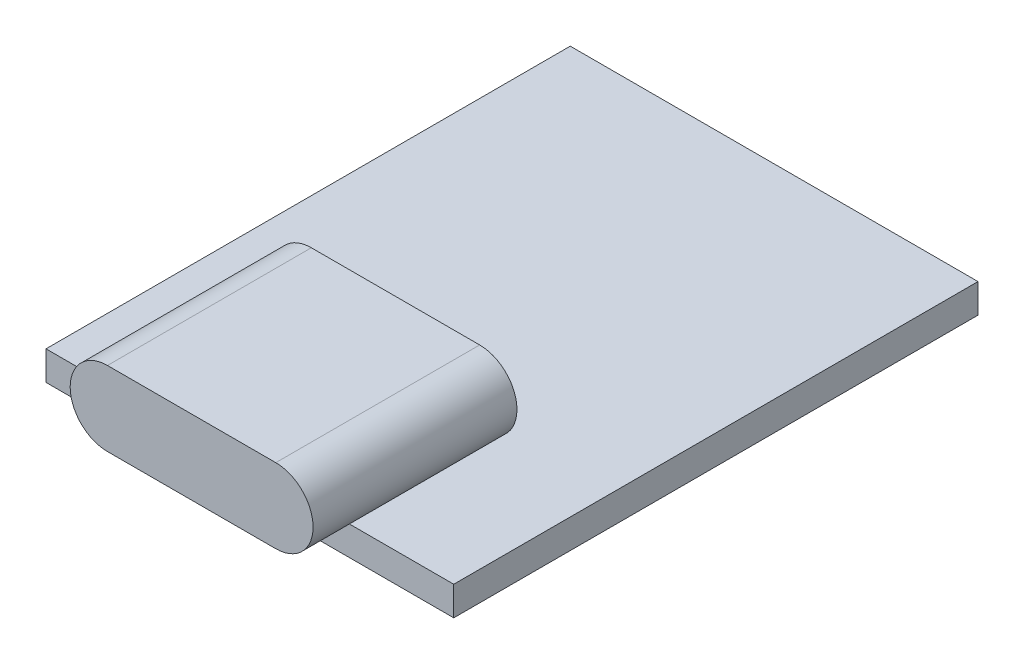
ISO-10303-21;
HEADER;
FILE_DESCRIPTION(('STEP AP214'),'2;1');
FILE_NAME('part.step','',(''),(''),'','','');
FILE_SCHEMA(('AUTOMOTIVE_DESIGN { 1 0 10303 214 1 1 1 1 }'));
ENDSEC;
DATA;
#1=APPLICATION_CONTEXT('core data for automotive mechanical design processes');
#2=APPLICATION_PROTOCOL_DEFINITION('international standard','automotive_design',2000,#1);
#3=PRODUCT_CONTEXT('',#1,'mechanical');
#4=PRODUCT('Part','Part','',(#3));
#5=PRODUCT_RELATED_PRODUCT_CATEGORY('part','',(#4));
#6=PRODUCT_DEFINITION_FORMATION('','',#4);
#7=PRODUCT_DEFINITION_CONTEXT('part definition',#1,'design');
#8=PRODUCT_DEFINITION('design','',#6,#7);
#9=PRODUCT_DEFINITION_SHAPE('','',#8);
#10=(LENGTH_UNIT() NAMED_UNIT(*) SI_UNIT(.MILLI.,.METRE.));
#11=(NAMED_UNIT(*) PLANE_ANGLE_UNIT() SI_UNIT($,.RADIAN.));
#12=(NAMED_UNIT(*) SI_UNIT($,.STERADIAN.) SOLID_ANGLE_UNIT());
#13=UNCERTAINTY_MEASURE_WITH_UNIT(LENGTH_MEASURE(1.E-05),#10,'distance_accuracy_value','');
#14=(GEOMETRIC_REPRESENTATION_CONTEXT(3) GLOBAL_UNCERTAINTY_ASSIGNED_CONTEXT((#13)) GLOBAL_UNIT_ASSIGNED_CONTEXT((#10,
#11,#12)) REPRESENTATION_CONTEXT('',''));
#15=CARTESIAN_POINT('',(0.,0.,0.));
#16=DIRECTION('',(0.,0.,1.));
#17=DIRECTION('',(1.,0.,0.));
#18=AXIS2_PLACEMENT_3D('',#15,#16,#17);
#19=CARTESIAN_POINT('',(0.,1.,0.));
#20=DIRECTION('',(1.,0.,0.));
#21=DIRECTION('',(0.,0.,-1.));
#22=AXIS2_PLACEMENT_3D('',#19,#20,#21);
#23=PLANE('',#22);
#24=DIRECTION('',(0.,0.,1.));
#25=VECTOR('',#24,1.);
#26=CARTESIAN_POINT('',(0.,0.,0.));
#27=LINE('',#26,#25);
#28=CARTESIAN_POINT('',(0.,0.,0.));
#29=VERTEX_POINT('',#28);
#30=CARTESIAN_POINT('',(0.,0.,18.));
#31=VERTEX_POINT('',#30);
#32=EDGE_CURVE('E153',#29,#31,#27,.T.);
#33=ORIENTED_EDGE('',*,*,#32,.T.);
#34=DIRECTION('',(0.,-1.,0.));
#35=VECTOR('',#34,1.);
#36=CARTESIAN_POINT('',(0.,1.,18.));
#37=LINE('',#36,#35);
#38=CARTESIAN_POINT('',(0.,1.,18.));
#39=VERTEX_POINT('',#38);
#40=EDGE_CURVE('E11',#39,#31,#37,.T.);
#41=ORIENTED_EDGE('',*,*,#40,.F.);
#42=DIRECTION('',(0.,0.,1.));
#43=VECTOR('',#42,1.);
#44=CARTESIAN_POINT('',(0.,1.,0.));
#45=LINE('',#44,#43);
#46=CARTESIAN_POINT('',(0.,1.,0.));
#47=VERTEX_POINT('',#46);
#48=EDGE_CURVE('E157',#47,#39,#45,.T.);
#49=ORIENTED_EDGE('',*,*,#48,.F.);
#50=DIRECTION('',(0.,-1.,0.));
#51=VECTOR('',#50,1.);
#52=CARTESIAN_POINT('',(0.,1.,0.));
#53=LINE('',#52,#51);
#54=EDGE_CURVE('E165',#47,#29,#53,.T.);
#55=ORIENTED_EDGE('',*,*,#54,.T.);
#56=EDGE_LOOP('',(#33,#41,#49,#55));
#57=FACE_BOUND('',#56,.T.);
#58=ADVANCED_FACE('F34',(#57),#23,.F.);
#59=CARTESIAN_POINT('',(0.,1.,18.));
#60=DIRECTION('',(0.,0.,-1.));
#61=DIRECTION('',(-1.,0.,0.));
#62=AXIS2_PLACEMENT_3D('',#59,#60,#61);
#63=PLANE('',#62);
#64=DIRECTION('',(1.,0.,0.));
#65=VECTOR('',#64,1.);
#66=CARTESIAN_POINT('',(0.,0.,18.));
#67=LINE('',#66,#65);
#68=CARTESIAN_POINT('',(14.,0.,18.));
#69=VERTEX_POINT('',#68);
#70=EDGE_CURVE('E168',#31,#69,#67,.T.);
#71=ORIENTED_EDGE('',*,*,#70,.T.);
#72=DIRECTION('',(0.,-1.,0.));
#73=VECTOR('',#72,1.);
#74=CARTESIAN_POINT('',(14.,1.,18.));
#75=LINE('',#74,#73);
#76=CARTESIAN_POINT('',(14.,1.,18.));
#77=VERTEX_POINT('',#76);
#78=EDGE_CURVE('E41',#77,#69,#75,.T.);
#79=ORIENTED_EDGE('',*,*,#78,.F.);
#80=DIRECTION('',(1.,0.,0.));
#81=VECTOR('',#80,1.);
#82=CARTESIAN_POINT('',(0.,1.,18.));
#83=LINE('',#82,#81);
#84=CARTESIAN_POINT('',(9.89,1.,18.));
#85=VERTEX_POINT('',#84);
#86=EDGE_CURVE('E159',#85,#77,#83,.T.);
#87=ORIENTED_EDGE('',*,*,#86,.F.);
#88=CARTESIAN_POINT('',(4.11,1.,18.));
#89=VERTEX_POINT('',#88);
#90=EDGE_CURVE('E162',#89,#85,#83,.T.);
#91=ORIENTED_EDGE('',*,*,#90,.F.);
#92=EDGE_CURVE('E85',#39,#89,#83,.T.);
#93=ORIENTED_EDGE('',*,*,#92,.F.);
#94=ORIENTED_EDGE('',*,*,#40,.T.);
#95=EDGE_LOOP('',(#71,#79,#87,#91,#93,#94));
#96=FACE_BOUND('',#95,.T.);
#97=ADVANCED_FACE('F198',(#96),#63,.F.);
#98=CARTESIAN_POINT('',(14.,1.,0.));
#99=DIRECTION('',(-1.,0.,0.));
#100=DIRECTION('',(0.,0.,1.));
#101=AXIS2_PLACEMENT_3D('',#98,#99,#100);
#102=PLANE('',#101);
#103=DIRECTION('',(0.,0.,-1.));
#104=VECTOR('',#103,1.);
#105=CARTESIAN_POINT('',(14.,0.,0.));
#106=LINE('',#105,#104);
#107=CARTESIAN_POINT('',(14.,0.,0.));
#108=VERTEX_POINT('',#107);
#109=EDGE_CURVE('E170',#69,#108,#106,.T.);
#110=ORIENTED_EDGE('',*,*,#109,.T.);
#111=DIRECTION('',(0.,-1.,0.));
#112=VECTOR('',#111,1.);
#113=CARTESIAN_POINT('',(14.,1.,0.));
#114=LINE('',#113,#112);
#115=CARTESIAN_POINT('',(14.,1.,0.));
#116=VERTEX_POINT('',#115);
#117=EDGE_CURVE('E174',#116,#108,#114,.T.);
#118=ORIENTED_EDGE('',*,*,#117,.F.);
#119=DIRECTION('',(0.,0.,-1.));
#120=VECTOR('',#119,1.);
#121=CARTESIAN_POINT('',(14.,1.,0.));
#122=LINE('',#121,#120);
#123=EDGE_CURVE('E161',#77,#116,#122,.T.);
#124=ORIENTED_EDGE('',*,*,#123,.F.);
#125=ORIENTED_EDGE('',*,*,#78,.T.);
#126=EDGE_LOOP('',(#110,#118,#124,#125));
#127=FACE_BOUND('',#126,.T.);
#128=ADVANCED_FACE('F180',(#127),#102,.F.);
#129=CARTESIAN_POINT('',(0.,1.,0.));
#130=DIRECTION('',(0.,0.,1.));
#131=DIRECTION('',(1.,0.,0.));
#132=AXIS2_PLACEMENT_3D('',#129,#130,#131);
#133=PLANE('',#132);
#134=DIRECTION('',(-1.,0.,0.));
#135=VECTOR('',#134,1.);
#136=CARTESIAN_POINT('',(0.,0.,0.));
#137=LINE('',#136,#135);
#138=EDGE_CURVE('E78',#108,#29,#137,.T.);
#139=ORIENTED_EDGE('',*,*,#138,.T.);
#140=ORIENTED_EDGE('',*,*,#54,.F.);
#141=DIRECTION('',(-1.,0.,0.));
#142=VECTOR('',#141,1.);
#143=CARTESIAN_POINT('',(0.,1.,0.));
#144=LINE('',#143,#142);
#145=EDGE_CURVE('E57',#116,#47,#144,.T.);
#146=ORIENTED_EDGE('',*,*,#145,.F.);
#147=ORIENTED_EDGE('',*,*,#117,.T.);
#148=EDGE_LOOP('',(#139,#140,#146,#147));
#149=FACE_BOUND('',#148,.T.);
#150=ADVANCED_FACE('F189',(#149),#133,.F.);
#151=CARTESIAN_POINT('',(0.,1.,0.));
#152=DIRECTION('',(0.,1.,0.));
#153=DIRECTION('',(0.,0.,1.));
#154=AXIS2_PLACEMENT_3D('',#151,#152,#153);
#155=PLANE('',#154);
#156=DIRECTION('',(0.,0.,1.));
#157=VECTOR('',#156,1.);
#158=CARTESIAN_POINT('',(4.11,1.,13.));
#159=LINE('',#158,#157);
#160=CARTESIAN_POINT('',(4.11,1.,13.));
#161=VERTEX_POINT('',#160);
#162=EDGE_CURVE('E123',#161,#89,#159,.T.);
#163=ORIENTED_EDGE('',*,*,#162,.F.);
#164=DIRECTION('',(-1.,0.,0.));
#165=VECTOR('',#164,1.);
#166=CARTESIAN_POINT('',(0.,1.,13.));
#167=LINE('',#166,#165);
#168=CARTESIAN_POINT('',(9.89,1.,13.));
#169=VERTEX_POINT('',#168);
#170=EDGE_CURVE('E146',#169,#161,#167,.T.);
#171=ORIENTED_EDGE('',*,*,#170,.F.);
#172=DIRECTION('',(0.,0.,1.));
#173=VECTOR('',#172,1.);
#174=CARTESIAN_POINT('',(9.89,1.,13.));
#175=LINE('',#174,#173);
#176=EDGE_CURVE('E48',#169,#85,#175,.T.);
#177=ORIENTED_EDGE('',*,*,#176,.T.);
#178=ORIENTED_EDGE('',*,*,#86,.T.);
#179=ORIENTED_EDGE('',*,*,#123,.T.);
#180=ORIENTED_EDGE('',*,*,#145,.T.);
#181=ORIENTED_EDGE('',*,*,#48,.T.);
#182=ORIENTED_EDGE('',*,*,#92,.T.);
#183=EDGE_LOOP('',(#163,#171,#177,#178,#179,#180,#181,#182));
#184=FACE_BOUND('',#183,.T.);
#185=ADVANCED_FACE('F191',(#184),#155,.T.);
#186=CARTESIAN_POINT('',(0.,0.,0.));
#187=DIRECTION('',(0.,1.,0.));
#188=DIRECTION('',(0.,0.,1.));
#189=AXIS2_PLACEMENT_3D('',#186,#187,#188);
#190=PLANE('',#189);
#191=ORIENTED_EDGE('',*,*,#32,.F.);
#192=ORIENTED_EDGE('',*,*,#138,.F.);
#193=ORIENTED_EDGE('',*,*,#109,.F.);
#194=ORIENTED_EDGE('',*,*,#70,.F.);
#195=EDGE_LOOP('',(#191,#192,#193,#194));
#196=FACE_BOUND('',#195,.T.);
#197=ADVANCED_FACE('F185',(#196),#190,.F.);
#198=CARTESIAN_POINT('',(0.,1.,13.));
#199=DIRECTION('',(0.,1.,0.));
#200=DIRECTION('',(0.,0.,1.));
#201=AXIS2_PLACEMENT_3D('',#198,#199,#200);
#202=PLANE('',#201);
#203=CARTESIAN_POINT('',(4.11,1.,20.));
#204=VERTEX_POINT('',#203);
#205=EDGE_CURVE('E116',#89,#204,#159,.T.);
#206=ORIENTED_EDGE('',*,*,#205,.F.);
#207=ORIENTED_EDGE('',*,*,#90,.T.);
#208=CARTESIAN_POINT('',(9.89,1.,20.));
#209=VERTEX_POINT('',#208);
#210=EDGE_CURVE('E138',#85,#209,#175,.T.);
#211=ORIENTED_EDGE('',*,*,#210,.T.);
#212=DIRECTION('',(-1.,0.,0.));
#213=VECTOR('',#212,1.);
#214=CARTESIAN_POINT('',(0.,1.,20.));
#215=LINE('',#214,#213);
#216=EDGE_CURVE('E132',#209,#204,#215,.T.);
#217=ORIENTED_EDGE('',*,*,#216,.T.);
#218=EDGE_LOOP('',(#206,#207,#211,#217));
#219=FACE_BOUND('',#218,.T.);
#220=ADVANCED_FACE('F137',(#219),#202,.F.);
#221=CARTESIAN_POINT('',(4.11,2.28,13.));
#222=DIRECTION('',(0.,0.,1.));
#223=DIRECTION('',(1.,0.,0.));
#224=AXIS2_PLACEMENT_3D('',#221,#222,#223);
#225=CYLINDRICAL_SURFACE('',#224,1.28);
#226=ORIENTED_EDGE('',*,*,#162,.T.);
#227=ORIENTED_EDGE('',*,*,#205,.T.);
#228=CARTESIAN_POINT('',(4.11,2.28,20.));
#229=DIRECTION('',(0.,0.,1.));
#230=DIRECTION('',(1.,0.,0.));
#231=AXIS2_PLACEMENT_3D('',#228,#229,#230);
#232=CIRCLE('',#231,1.28);
#233=CARTESIAN_POINT('',(4.11,3.56,20.));
#234=VERTEX_POINT('',#233);
#235=EDGE_CURVE('E119',#234,#204,#232,.T.);
#236=ORIENTED_EDGE('',*,*,#235,.F.);
#237=DIRECTION('',(0.,0.,1.));
#238=VECTOR('',#237,1.);
#239=CARTESIAN_POINT('',(4.11,3.56,13.));
#240=LINE('',#239,#238);
#241=CARTESIAN_POINT('',(4.11,3.56,13.));
#242=VERTEX_POINT('',#241);
#243=EDGE_CURVE('E151',#242,#234,#240,.T.);
#244=ORIENTED_EDGE('',*,*,#243,.F.);
#245=CARTESIAN_POINT('',(4.11,2.28,13.));
#246=DIRECTION('',(0.,0.,1.));
#247=DIRECTION('',(1.,0.,0.));
#248=AXIS2_PLACEMENT_3D('',#245,#246,#247);
#249=CIRCLE('',#248,1.28);
#250=EDGE_CURVE('E144',#242,#161,#249,.T.);
#251=ORIENTED_EDGE('',*,*,#250,.T.);
#252=EDGE_LOOP('',(#226,#227,#236,#244,#251));
#253=FACE_BOUND('',#252,.T.);
#254=ADVANCED_FACE('F118',(#253),#225,.T.);
#255=CARTESIAN_POINT('',(0.,3.56,13.));
#256=DIRECTION('',(0.,-1.,0.));
#257=DIRECTION('',(0.,0.,-1.));
#258=AXIS2_PLACEMENT_3D('',#255,#256,#257);
#259=PLANE('',#258);
#260=ORIENTED_EDGE('',*,*,#243,.T.);
#261=DIRECTION('',(1.,0.,0.));
#262=VECTOR('',#261,1.);
#263=CARTESIAN_POINT('',(0.,3.56,20.));
#264=LINE('',#263,#262);
#265=CARTESIAN_POINT('',(9.89,3.56,20.));
#266=VERTEX_POINT('',#265);
#267=EDGE_CURVE('E135',#234,#266,#264,.T.);
#268=ORIENTED_EDGE('',*,*,#267,.T.);
#269=DIRECTION('',(0.,0.,1.));
#270=VECTOR('',#269,1.);
#271=CARTESIAN_POINT('',(9.89,3.56,13.));
#272=LINE('',#271,#270);
#273=CARTESIAN_POINT('',(9.89,3.56,13.));
#274=VERTEX_POINT('',#273);
#275=EDGE_CURVE('E154',#274,#266,#272,.T.);
#276=ORIENTED_EDGE('',*,*,#275,.F.);
#277=DIRECTION('',(1.,0.,0.));
#278=VECTOR('',#277,1.);
#279=CARTESIAN_POINT('',(0.,3.56,13.));
#280=LINE('',#279,#278);
#281=EDGE_CURVE('E126',#242,#274,#280,.T.);
#282=ORIENTED_EDGE('',*,*,#281,.F.);
#283=EDGE_LOOP('',(#260,#268,#276,#282));
#284=FACE_BOUND('',#283,.T.);
#285=ADVANCED_FACE('F242',(#284),#259,.F.);
#286=CARTESIAN_POINT('',(9.89,2.28,13.));
#287=DIRECTION('',(0.,0.,1.));
#288=DIRECTION('',(1.,0.,0.));
#289=AXIS2_PLACEMENT_3D('',#286,#287,#288);
#290=CYLINDRICAL_SURFACE('',#289,1.28);
#291=ORIENTED_EDGE('',*,*,#275,.T.);
#292=CARTESIAN_POINT('',(9.89,2.28,20.));
#293=DIRECTION('',(0.,0.,1.));
#294=DIRECTION('',(1.,0.,0.));
#295=AXIS2_PLACEMENT_3D('',#292,#293,#294);
#296=CIRCLE('',#295,1.28);
#297=EDGE_CURVE('E139',#266,#209,#296,.F.);
#298=ORIENTED_EDGE('',*,*,#297,.T.);
#299=ORIENTED_EDGE('',*,*,#210,.F.);
#300=ORIENTED_EDGE('',*,*,#176,.F.);
#301=CARTESIAN_POINT('',(9.89,2.28,13.));
#302=DIRECTION('',(0.,0.,1.));
#303=DIRECTION('',(1.,0.,0.));
#304=AXIS2_PLACEMENT_3D('',#301,#302,#303);
#305=CIRCLE('',#304,1.28);
#306=EDGE_CURVE('E148',#274,#169,#305,.F.);
#307=ORIENTED_EDGE('',*,*,#306,.F.);
#308=EDGE_LOOP('',(#291,#298,#299,#300,#307));
#309=FACE_BOUND('',#308,.T.);
#310=ADVANCED_FACE('F249',(#309),#290,.T.);
#311=CARTESIAN_POINT('',(0.,0.,13.));
#312=DIRECTION('',(0.,0.,1.));
#313=DIRECTION('',(1.,0.,0.));
#314=AXIS2_PLACEMENT_3D('',#311,#312,#313);
#315=PLANE('',#314);
#316=ORIENTED_EDGE('',*,*,#250,.F.);
#317=ORIENTED_EDGE('',*,*,#281,.T.);
#318=ORIENTED_EDGE('',*,*,#306,.T.);
#319=ORIENTED_EDGE('',*,*,#170,.T.);
#320=EDGE_LOOP('',(#316,#317,#318,#319));
#321=FACE_BOUND('',#320,.T.);
#322=ADVANCED_FACE('F257',(#321),#315,.F.);
#323=CARTESIAN_POINT('',(0.,0.,20.));
#324=DIRECTION('',(0.,0.,1.));
#325=DIRECTION('',(1.,0.,0.));
#326=AXIS2_PLACEMENT_3D('',#323,#324,#325);
#327=PLANE('',#326);
#328=ORIENTED_EDGE('',*,*,#235,.T.);
#329=ORIENTED_EDGE('',*,*,#216,.F.);
#330=ORIENTED_EDGE('',*,*,#297,.F.);
#331=ORIENTED_EDGE('',*,*,#267,.F.);
#332=EDGE_LOOP('',(#328,#329,#330,#331));
#333=FACE_BOUND('',#332,.T.);
#334=ADVANCED_FACE('F130',(#333),#327,.T.);
#335=CLOSED_SHELL('',(#58,#97,#128,#150,#185,#197,#220,#254,#285,#310,#322,#334));
#336=MANIFOLD_SOLID_BREP('B2',#335);
#337=ADVANCED_BREP_SHAPE_REPRESENTATION('',(#18,#336),#14);
#338=SHAPE_DEFINITION_REPRESENTATION(#9,#337);
ENDSEC;
END-ISO-10303-21;
